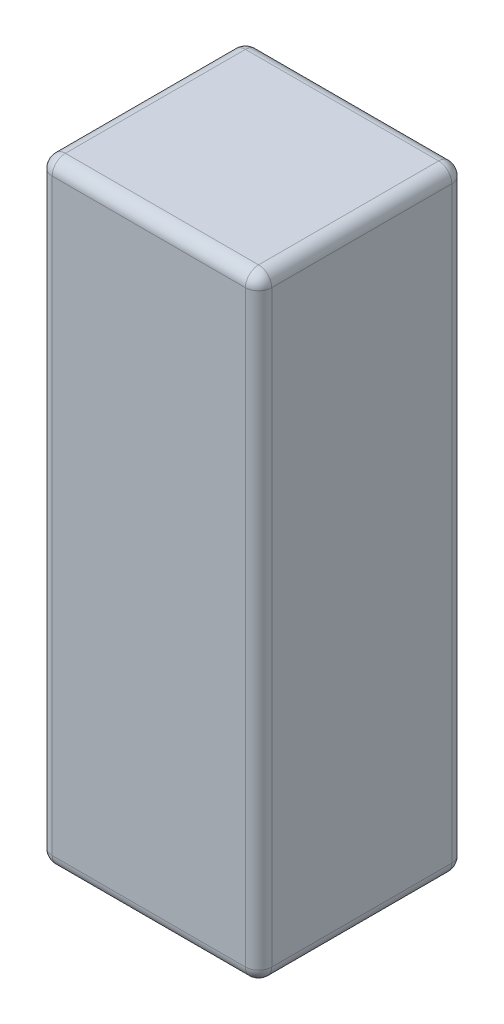
ISO-10303-21;
HEADER;
FILE_DESCRIPTION(('STEP AP214'),'2;1');
FILE_NAME('part.step','',(''),(''),'','','');
FILE_SCHEMA(('AUTOMOTIVE_DESIGN { 1 0 10303 214 1 1 1 1 }'));
ENDSEC;
DATA;
#1=APPLICATION_CONTEXT('core data for automotive mechanical design processes');
#2=APPLICATION_PROTOCOL_DEFINITION('international standard','automotive_design',2000,#1);
#3=PRODUCT_CONTEXT('',#1,'mechanical');
#4=PRODUCT('Part','Part','',(#3));
#5=PRODUCT_RELATED_PRODUCT_CATEGORY('part','',(#4));
#6=PRODUCT_DEFINITION_FORMATION('','',#4);
#7=PRODUCT_DEFINITION_CONTEXT('part definition',#1,'design');
#8=PRODUCT_DEFINITION('design','',#6,#7);
#9=PRODUCT_DEFINITION_SHAPE('','',#8);
#10=(LENGTH_UNIT() NAMED_UNIT(*) SI_UNIT(.MILLI.,.METRE.));
#11=(NAMED_UNIT(*) PLANE_ANGLE_UNIT() SI_UNIT($,.RADIAN.));
#12=(NAMED_UNIT(*) SI_UNIT($,.STERADIAN.) SOLID_ANGLE_UNIT());
#13=UNCERTAINTY_MEASURE_WITH_UNIT(LENGTH_MEASURE(1.E-05),#10,'distance_accuracy_value','');
#14=(GEOMETRIC_REPRESENTATION_CONTEXT(3) GLOBAL_UNCERTAINTY_ASSIGNED_CONTEXT((#13)) GLOBAL_UNIT_ASSIGNED_CONTEXT((#10,
#11,#12)) REPRESENTATION_CONTEXT('',''));
#15=CARTESIAN_POINT('',(0.,0.,0.));
#16=DIRECTION('',(0.,0.,1.));
#17=DIRECTION('',(1.,0.,0.));
#18=AXIS2_PLACEMENT_3D('',#15,#16,#17);
#19=CARTESIAN_POINT('',(25.,-70.,47.));
#20=DIRECTION('',(-1.,0.,0.));
#21=DIRECTION('',(0.,0.,1.));
#22=AXIS2_PLACEMENT_3D('',#19,#20,#21);
#23=PLANE('',#22);
#24=DIRECTION('',(0.,1.,0.));
#25=VECTOR('',#24,1.);
#26=CARTESIAN_POINT('',(25.,-70.,44.));
#27=LINE('',#26,#25);
#28=CARTESIAN_POINT('',(25.,67.,44.));
#29=VERTEX_POINT('',#28);
#30=CARTESIAN_POINT('',(25.,-67.,44.));
#31=VERTEX_POINT('',#30);
#32=EDGE_CURVE('E190',#29,#31,#27,.F.);
#33=ORIENTED_EDGE('',*,*,#32,.T.);
#34=DIRECTION('',(0.,0.,-1.));
#35=VECTOR('',#34,1.);
#36=CARTESIAN_POINT('',(25.,-67.,47.));
#37=LINE('',#36,#35);
#38=CARTESIAN_POINT('',(25.,-67.,3.));
#39=VERTEX_POINT('',#38);
#40=EDGE_CURVE('E143',#31,#39,#37,.T.);
#41=ORIENTED_EDGE('',*,*,#40,.T.);
#42=DIRECTION('',(0.,1.,0.));
#43=VECTOR('',#42,1.);
#44=CARTESIAN_POINT('',(25.,70.,3.));
#45=LINE('',#44,#43);
#46=CARTESIAN_POINT('',(25.,67.,3.));
#47=VERTEX_POINT('',#46);
#48=EDGE_CURVE('E186',#39,#47,#45,.T.);
#49=ORIENTED_EDGE('',*,*,#48,.T.);
#50=DIRECTION('',(0.,0.,-1.));
#51=VECTOR('',#50,1.);
#52=CARTESIAN_POINT('',(25.,67.,47.));
#53=LINE('',#52,#51);
#54=EDGE_CURVE('E188',#47,#29,#53,.F.);
#55=ORIENTED_EDGE('',*,*,#54,.T.);
#56=EDGE_LOOP('',(#33,#41,#49,#55));
#57=FACE_BOUND('',#56,.T.);
#58=ADVANCED_FACE('F34',(#57),#23,.F.);
#59=CARTESIAN_POINT('',(-25.,70.,47.));
#60=DIRECTION('',(0.,-1.,0.));
#61=DIRECTION('',(0.,0.,-1.));
#62=AXIS2_PLACEMENT_3D('',#59,#60,#61);
#63=PLANE('',#62);
#64=DIRECTION('',(0.,0.,-1.));
#65=VECTOR('',#64,1.);
#66=CARTESIAN_POINT('',(-22.,70.,47.));
#67=LINE('',#66,#65);
#68=CARTESIAN_POINT('',(-22.,70.,3.));
#69=VERTEX_POINT('',#68);
#70=CARTESIAN_POINT('',(-22.,70.,44.));
#71=VERTEX_POINT('',#70);
#72=EDGE_CURVE('E43',#69,#71,#67,.F.);
#73=ORIENTED_EDGE('',*,*,#72,.T.);
#74=DIRECTION('',(-1.,0.,0.));
#75=VECTOR('',#74,1.);
#76=CARTESIAN_POINT('',(-25.,70.,44.));
#77=LINE('',#76,#75);
#78=CARTESIAN_POINT('',(22.,70.,44.));
#79=VERTEX_POINT('',#78);
#80=EDGE_CURVE('E11',#71,#79,#77,.F.);
#81=ORIENTED_EDGE('',*,*,#80,.T.);
#82=DIRECTION('',(0.,0.,-1.));
#83=VECTOR('',#82,1.);
#84=CARTESIAN_POINT('',(22.,70.,47.));
#85=LINE('',#84,#83);
#86=CARTESIAN_POINT('',(22.,70.,3.));
#87=VERTEX_POINT('',#86);
#88=EDGE_CURVE('E204',#79,#87,#85,.T.);
#89=ORIENTED_EDGE('',*,*,#88,.T.);
#90=DIRECTION('',(-1.,0.,0.));
#91=VECTOR('',#90,1.);
#92=CARTESIAN_POINT('',(-25.,70.,3.));
#93=LINE('',#92,#91);
#94=EDGE_CURVE('E202',#87,#69,#93,.T.);
#95=ORIENTED_EDGE('',*,*,#94,.T.);
#96=EDGE_LOOP('',(#73,#81,#89,#95));
#97=FACE_BOUND('',#96,.T.);
#98=ADVANCED_FACE('F276',(#97),#63,.F.);
#99=CARTESIAN_POINT('',(-25.,-70.,47.));
#100=DIRECTION('',(1.,0.,0.));
#101=DIRECTION('',(0.,0.,-1.));
#102=AXIS2_PLACEMENT_3D('',#99,#100,#101);
#103=PLANE('',#102);
#104=DIRECTION('',(0.,-1.,0.));
#105=VECTOR('',#104,1.);
#106=CARTESIAN_POINT('',(-25.,-70.,3.));
#107=LINE('',#106,#105);
#108=CARTESIAN_POINT('',(-25.,67.,3.));
#109=VERTEX_POINT('',#108);
#110=CARTESIAN_POINT('',(-25.,-67.,3.));
#111=VERTEX_POINT('',#110);
#112=EDGE_CURVE('E172',#109,#111,#107,.T.);
#113=ORIENTED_EDGE('',*,*,#112,.T.);
#114=DIRECTION('',(0.,0.,-1.));
#115=VECTOR('',#114,1.);
#116=CARTESIAN_POINT('',(-25.,-67.,47.));
#117=LINE('',#116,#115);
#118=CARTESIAN_POINT('',(-25.,-67.,44.));
#119=VERTEX_POINT('',#118);
#120=EDGE_CURVE('E174',#111,#119,#117,.F.);
#121=ORIENTED_EDGE('',*,*,#120,.T.);
#122=DIRECTION('',(0.,-1.,0.));
#123=VECTOR('',#122,1.);
#124=CARTESIAN_POINT('',(-25.,-70.,44.));
#125=LINE('',#124,#123);
#126=CARTESIAN_POINT('',(-25.,67.,44.));
#127=VERTEX_POINT('',#126);
#128=EDGE_CURVE('E170',#119,#127,#125,.F.);
#129=ORIENTED_EDGE('',*,*,#128,.T.);
#130=DIRECTION('',(0.,0.,-1.));
#131=VECTOR('',#130,1.);
#132=CARTESIAN_POINT('',(-25.,67.,47.));
#133=LINE('',#132,#131);
#134=EDGE_CURVE('E168',#127,#109,#133,.T.);
#135=ORIENTED_EDGE('',*,*,#134,.T.);
#136=EDGE_LOOP('',(#113,#121,#129,#135));
#137=FACE_BOUND('',#136,.T.);
#138=ADVANCED_FACE('F310',(#137),#103,.F.);
#139=CARTESIAN_POINT('',(-25.,-70.,47.));
#140=DIRECTION('',(0.,1.,0.));
#141=DIRECTION('',(0.,0.,1.));
#142=AXIS2_PLACEMENT_3D('',#139,#140,#141);
#143=PLANE('',#142);
#144=DIRECTION('',(1.,0.,0.));
#145=VECTOR('',#144,1.);
#146=CARTESIAN_POINT('',(-25.,-70.,44.));
#147=LINE('',#146,#145);
#148=CARTESIAN_POINT('',(22.,-70.,44.));
#149=VERTEX_POINT('',#148);
#150=CARTESIAN_POINT('',(-22.,-70.,44.));
#151=VERTEX_POINT('',#150);
#152=EDGE_CURVE('E129',#149,#151,#147,.F.);
#153=ORIENTED_EDGE('',*,*,#152,.T.);
#154=DIRECTION('',(0.,0.,-1.));
#155=VECTOR('',#154,1.);
#156=CARTESIAN_POINT('',(-22.,-70.,47.));
#157=LINE('',#156,#155);
#158=CARTESIAN_POINT('',(-22.,-70.,3.));
#159=VERTEX_POINT('',#158);
#160=EDGE_CURVE('E166',#151,#159,#157,.T.);
#161=ORIENTED_EDGE('',*,*,#160,.T.);
#162=DIRECTION('',(1.,0.,0.));
#163=VECTOR('',#162,1.);
#164=CARTESIAN_POINT('',(25.,-70.,3.));
#165=LINE('',#164,#163);
#166=CARTESIAN_POINT('',(22.,-70.,3.));
#167=VERTEX_POINT('',#166);
#168=EDGE_CURVE('E132',#159,#167,#165,.T.);
#169=ORIENTED_EDGE('',*,*,#168,.T.);
#170=DIRECTION('',(0.,0.,-1.));
#171=VECTOR('',#170,1.);
#172=CARTESIAN_POINT('',(22.,-70.,47.));
#173=LINE('',#172,#171);
#174=EDGE_CURVE('E124',#167,#149,#173,.F.);
#175=ORIENTED_EDGE('',*,*,#174,.T.);
#176=EDGE_LOOP('',(#153,#161,#169,#175));
#177=FACE_BOUND('',#176,.T.);
#178=ADVANCED_FACE('F126',(#177),#143,.F.);
#179=CARTESIAN_POINT('',(0.,0.,47.));
#180=DIRECTION('',(0.,0.,-1.));
#181=DIRECTION('',(-1.,0.,0.));
#182=AXIS2_PLACEMENT_3D('',#179,#180,#181);
#183=PLANE('',#182);
#184=DIRECTION('',(0.,-1.,0.));
#185=VECTOR('',#184,1.);
#186=CARTESIAN_POINT('',(-22.,0.,47.));
#187=LINE('',#186,#185);
#188=CARTESIAN_POINT('',(-22.,67.,47.));
#189=VERTEX_POINT('',#188);
#190=CARTESIAN_POINT('',(-22.,-67.,47.));
#191=VERTEX_POINT('',#190);
#192=EDGE_CURVE('E195',#189,#191,#187,.T.);
#193=ORIENTED_EDGE('',*,*,#192,.T.);
#194=DIRECTION('',(1.,0.,0.));
#195=VECTOR('',#194,1.);
#196=CARTESIAN_POINT('',(0.,-67.,47.));
#197=LINE('',#196,#195);
#198=CARTESIAN_POINT('',(22.,-67.,47.));
#199=VERTEX_POINT('',#198);
#200=EDGE_CURVE('E199',#191,#199,#197,.T.);
#201=ORIENTED_EDGE('',*,*,#200,.T.);
#202=DIRECTION('',(0.,1.,0.));
#203=VECTOR('',#202,1.);
#204=CARTESIAN_POINT('',(22.,0.,47.));
#205=LINE('',#204,#203);
#206=CARTESIAN_POINT('',(22.,67.,47.));
#207=VERTEX_POINT('',#206);
#208=EDGE_CURVE('E197',#199,#207,#205,.T.);
#209=ORIENTED_EDGE('',*,*,#208,.T.);
#210=DIRECTION('',(-1.,0.,0.));
#211=VECTOR('',#210,1.);
#212=CARTESIAN_POINT('',(0.,67.,47.));
#213=LINE('',#212,#211);
#214=EDGE_CURVE('E193',#207,#189,#213,.T.);
#215=ORIENTED_EDGE('',*,*,#214,.T.);
#216=EDGE_LOOP('',(#193,#201,#209,#215));
#217=FACE_BOUND('',#216,.T.);
#218=ADVANCED_FACE('F290',(#217),#183,.F.);
#219=CARTESIAN_POINT('',(0.,0.,0.));
#220=DIRECTION('',(0.,0.,-1.));
#221=DIRECTION('',(-1.,0.,0.));
#222=AXIS2_PLACEMENT_3D('',#219,#220,#221);
#223=PLANE('',#222);
#224=DIRECTION('',(0.,1.,0.));
#225=VECTOR('',#224,1.);
#226=CARTESIAN_POINT('',(22.,-70.,0.));
#227=LINE('',#226,#225);
#228=CARTESIAN_POINT('',(22.,67.,0.));
#229=VERTEX_POINT('',#228);
#230=CARTESIAN_POINT('',(22.,-67.,0.));
#231=VERTEX_POINT('',#230);
#232=EDGE_CURVE('E179',#229,#231,#227,.F.);
#233=ORIENTED_EDGE('',*,*,#232,.T.);
#234=DIRECTION('',(1.,0.,0.));
#235=VECTOR('',#234,1.);
#236=CARTESIAN_POINT('',(-25.,-67.,0.));
#237=LINE('',#236,#235);
#238=CARTESIAN_POINT('',(-22.,-67.,0.));
#239=VERTEX_POINT('',#238);
#240=EDGE_CURVE('E183',#231,#239,#237,.F.);
#241=ORIENTED_EDGE('',*,*,#240,.T.);
#242=DIRECTION('',(0.,-1.,0.));
#243=VECTOR('',#242,1.);
#244=CARTESIAN_POINT('',(-22.,70.,0.));
#245=LINE('',#244,#243);
#246=CARTESIAN_POINT('',(-22.,67.,0.));
#247=VERTEX_POINT('',#246);
#248=EDGE_CURVE('E181',#239,#247,#245,.F.);
#249=ORIENTED_EDGE('',*,*,#248,.T.);
#250=DIRECTION('',(-1.,0.,0.));
#251=VECTOR('',#250,1.);
#252=CARTESIAN_POINT('',(25.,67.,0.));
#253=LINE('',#252,#251);
#254=EDGE_CURVE('E177',#247,#229,#253,.F.);
#255=ORIENTED_EDGE('',*,*,#254,.T.);
#256=EDGE_LOOP('',(#233,#241,#249,#255));
#257=FACE_BOUND('',#256,.T.);
#258=ADVANCED_FACE('F269',(#257),#223,.T.);
#259=CARTESIAN_POINT('',(22.,67.,47.));
#260=DIRECTION('',(0.,0.,-1.));
#261=DIRECTION('',(-1.,0.,0.));
#262=AXIS2_PLACEMENT_3D('',#259,#260,#261);
#263=CYLINDRICAL_SURFACE('',#262,3.);
#264=CARTESIAN_POINT('',(22.,67.,44.));
#265=DIRECTION('',(0.,0.,1.));
#266=DIRECTION('',(1.,0.,0.));
#267=AXIS2_PLACEMENT_3D('',#264,#265,#266);
#268=CIRCLE('',#267,3.);
#269=EDGE_CURVE('E38',#29,#79,#268,.T.);
#270=ORIENTED_EDGE('',*,*,#269,.F.);
#271=ORIENTED_EDGE('',*,*,#54,.F.);
#272=CARTESIAN_POINT('',(22.,67.,3.));
#273=DIRECTION('',(0.,0.,-1.));
#274=DIRECTION('',(-1.,0.,0.));
#275=AXIS2_PLACEMENT_3D('',#272,#273,#274);
#276=CIRCLE('',#275,3.);
#277=EDGE_CURVE('E163',#87,#47,#276,.T.);
#278=ORIENTED_EDGE('',*,*,#277,.F.);
#279=ORIENTED_EDGE('',*,*,#88,.F.);
#280=EDGE_LOOP('',(#270,#271,#278,#279));
#281=FACE_BOUND('',#280,.T.);
#282=ADVANCED_FACE('F36',(#281),#263,.T.);
#283=CARTESIAN_POINT('',(22.,67.,44.));
#284=DIRECTION('',(0.,0.,1.));
#285=DIRECTION('',(1.,0.,0.));
#286=AXIS2_PLACEMENT_3D('',#283,#284,#285);
#287=SPHERICAL_SURFACE('',#286,3.);
#288=CARTESIAN_POINT('',(22.,67.,44.));
#289=DIRECTION('',(0.,1.,0.));
#290=DIRECTION('',(0.,0.,1.));
#291=AXIS2_PLACEMENT_3D('',#288,#289,#290);
#292=CIRCLE('',#291,3.);
#293=EDGE_CURVE('E249',#29,#207,#292,.F.);
#294=ORIENTED_EDGE('',*,*,#293,.F.);
#295=ORIENTED_EDGE('',*,*,#269,.T.);
#296=CARTESIAN_POINT('',(22.,67.,44.));
#297=DIRECTION('',(1.,0.,0.));
#298=DIRECTION('',(0.,0.,-1.));
#299=AXIS2_PLACEMENT_3D('',#296,#297,#298);
#300=CIRCLE('',#299,3.);
#301=EDGE_CURVE('E56',#207,#79,#300,.F.);
#302=ORIENTED_EDGE('',*,*,#301,.F.);
#303=EDGE_LOOP('',(#294,#295,#302));
#304=FACE_BOUND('',#303,.T.);
#305=ADVANCED_FACE('F296',(#304),#287,.T.);
#306=CARTESIAN_POINT('',(22.,67.,3.));
#307=DIRECTION('',(0.,0.,1.));
#308=DIRECTION('',(1.,0.,0.));
#309=AXIS2_PLACEMENT_3D('',#306,#307,#308);
#310=SPHERICAL_SURFACE('',#309,3.);
#311=CARTESIAN_POINT('',(22.,67.,3.));
#312=DIRECTION('',(1.,0.,0.));
#313=DIRECTION('',(0.,1.,0.));
#314=AXIS2_PLACEMENT_3D('',#311,#312,#313);
#315=CIRCLE('',#314,3.);
#316=EDGE_CURVE('E243',#87,#229,#315,.F.);
#317=ORIENTED_EDGE('',*,*,#316,.F.);
#318=ORIENTED_EDGE('',*,*,#277,.T.);
#319=CARTESIAN_POINT('',(22.,67.,3.));
#320=DIRECTION('',(0.,1.,0.));
#321=DIRECTION('',(0.,0.,1.));
#322=AXIS2_PLACEMENT_3D('',#319,#320,#321);
#323=CIRCLE('',#322,3.);
#324=EDGE_CURVE('E246',#229,#47,#323,.F.);
#325=ORIENTED_EDGE('',*,*,#324,.F.);
#326=EDGE_LOOP('',(#317,#318,#325));
#327=FACE_BOUND('',#326,.T.);
#328=ADVANCED_FACE('F257',(#327),#310,.T.);
#329=CARTESIAN_POINT('',(0.,67.,44.));
#330=DIRECTION('',(-1.,0.,0.));
#331=DIRECTION('',(0.,0.,1.));
#332=AXIS2_PLACEMENT_3D('',#329,#330,#331);
#333=CYLINDRICAL_SURFACE('',#332,3.);
#334=ORIENTED_EDGE('',*,*,#301,.T.);
#335=ORIENTED_EDGE('',*,*,#80,.F.);
#336=CARTESIAN_POINT('',(-22.,67.,44.));
#337=DIRECTION('',(-1.,0.,0.));
#338=DIRECTION('',(0.,0.,1.));
#339=AXIS2_PLACEMENT_3D('',#336,#337,#338);
#340=CIRCLE('',#339,3.);
#341=EDGE_CURVE('E237',#189,#71,#340,.T.);
#342=ORIENTED_EDGE('',*,*,#341,.F.);
#343=ORIENTED_EDGE('',*,*,#214,.F.);
#344=EDGE_LOOP('',(#334,#335,#342,#343));
#345=FACE_BOUND('',#344,.T.);
#346=ADVANCED_FACE('F288',(#345),#333,.T.);
#347=CARTESIAN_POINT('',(22.,0.,44.));
#348=DIRECTION('',(0.,1.,0.));
#349=DIRECTION('',(0.,0.,1.));
#350=AXIS2_PLACEMENT_3D('',#347,#348,#349);
#351=CYLINDRICAL_SURFACE('',#350,3.);
#352=ORIENTED_EDGE('',*,*,#293,.T.);
#353=ORIENTED_EDGE('',*,*,#208,.F.);
#354=CARTESIAN_POINT('',(22.,-67.,44.));
#355=DIRECTION('',(0.,-1.,0.));
#356=DIRECTION('',(0.,0.,-1.));
#357=AXIS2_PLACEMENT_3D('',#354,#355,#356);
#358=CIRCLE('',#357,3.);
#359=EDGE_CURVE('E147',#31,#199,#358,.T.);
#360=ORIENTED_EDGE('',*,*,#359,.F.);
#361=ORIENTED_EDGE('',*,*,#32,.F.);
#362=EDGE_LOOP('',(#352,#353,#360,#361));
#363=FACE_BOUND('',#362,.T.);
#364=ADVANCED_FACE('F294',(#363),#351,.T.);
#365=CARTESIAN_POINT('',(22.,-67.,47.));
#366=DIRECTION('',(0.,0.,-1.));
#367=DIRECTION('',(-1.,0.,0.));
#368=AXIS2_PLACEMENT_3D('',#365,#366,#367);
#369=CYLINDRICAL_SURFACE('',#368,3.);
#370=CARTESIAN_POINT('',(22.,-67.,3.));
#371=DIRECTION('',(0.,0.,-1.));
#372=DIRECTION('',(-1.,0.,0.));
#373=AXIS2_PLACEMENT_3D('',#370,#371,#372);
#374=CIRCLE('',#373,3.);
#375=EDGE_CURVE('E148',#39,#167,#374,.T.);
#376=ORIENTED_EDGE('',*,*,#375,.F.);
#377=ORIENTED_EDGE('',*,*,#40,.F.);
#378=CARTESIAN_POINT('',(22.,-67.,44.));
#379=DIRECTION('',(0.,0.,1.));
#380=DIRECTION('',(1.,0.,0.));
#381=AXIS2_PLACEMENT_3D('',#378,#379,#380);
#382=CIRCLE('',#381,3.);
#383=EDGE_CURVE('E139',#149,#31,#382,.T.);
#384=ORIENTED_EDGE('',*,*,#383,.F.);
#385=ORIENTED_EDGE('',*,*,#174,.F.);
#386=EDGE_LOOP('',(#376,#377,#384,#385));
#387=FACE_BOUND('',#386,.T.);
#388=ADVANCED_FACE('F141',(#387),#369,.T.);
#389=CARTESIAN_POINT('',(22.,-70.,3.));
#390=DIRECTION('',(0.,-1.,0.));
#391=DIRECTION('',(0.,0.,-1.));
#392=AXIS2_PLACEMENT_3D('',#389,#390,#391);
#393=CYLINDRICAL_SURFACE('',#392,3.);
#394=ORIENTED_EDGE('',*,*,#324,.T.);
#395=ORIENTED_EDGE('',*,*,#48,.F.);
#396=CARTESIAN_POINT('',(22.,-67.,3.));
#397=DIRECTION('',(0.,-1.,0.));
#398=DIRECTION('',(0.,0.,-1.));
#399=AXIS2_PLACEMENT_3D('',#396,#397,#398);
#400=CIRCLE('',#399,3.);
#401=EDGE_CURVE('E233',#231,#39,#400,.T.);
#402=ORIENTED_EDGE('',*,*,#401,.F.);
#403=ORIENTED_EDGE('',*,*,#232,.F.);
#404=EDGE_LOOP('',(#394,#395,#402,#403));
#405=FACE_BOUND('',#404,.T.);
#406=ADVANCED_FACE('F265',(#405),#393,.T.);
#407=CARTESIAN_POINT('',(-25.,67.,3.));
#408=DIRECTION('',(1.,0.,0.));
#409=DIRECTION('',(0.,0.,-1.));
#410=AXIS2_PLACEMENT_3D('',#407,#408,#409);
#411=CYLINDRICAL_SURFACE('',#410,3.);
#412=ORIENTED_EDGE('',*,*,#316,.T.);
#413=ORIENTED_EDGE('',*,*,#254,.F.);
#414=CARTESIAN_POINT('',(-22.,67.,3.));
#415=DIRECTION('',(-1.,0.,0.));
#416=DIRECTION('',(0.,0.,1.));
#417=AXIS2_PLACEMENT_3D('',#414,#415,#416);
#418=CIRCLE('',#417,3.);
#419=EDGE_CURVE('E230',#69,#247,#418,.T.);
#420=ORIENTED_EDGE('',*,*,#419,.F.);
#421=ORIENTED_EDGE('',*,*,#94,.F.);
#422=EDGE_LOOP('',(#412,#413,#420,#421));
#423=FACE_BOUND('',#422,.T.);
#424=ADVANCED_FACE('F275',(#423),#411,.T.);
#425=CARTESIAN_POINT('',(-22.,67.,47.));
#426=DIRECTION('',(0.,0.,-1.));
#427=DIRECTION('',(-1.,0.,0.));
#428=AXIS2_PLACEMENT_3D('',#425,#426,#427);
#429=CYLINDRICAL_SURFACE('',#428,3.);
#430=CARTESIAN_POINT('',(-22.,67.,44.));
#431=DIRECTION('',(0.,0.,1.));
#432=DIRECTION('',(1.,0.,0.));
#433=AXIS2_PLACEMENT_3D('',#430,#431,#432);
#434=CIRCLE('',#433,3.);
#435=EDGE_CURVE('E240',#71,#127,#434,.T.);
#436=ORIENTED_EDGE('',*,*,#435,.F.);
#437=ORIENTED_EDGE('',*,*,#72,.F.);
#438=CARTESIAN_POINT('',(-22.,67.,3.));
#439=DIRECTION('',(0.,0.,-1.));
#440=DIRECTION('',(-1.,0.,0.));
#441=AXIS2_PLACEMENT_3D('',#438,#439,#440);
#442=CIRCLE('',#441,3.);
#443=EDGE_CURVE('E227',#109,#69,#442,.T.);
#444=ORIENTED_EDGE('',*,*,#443,.F.);
#445=ORIENTED_EDGE('',*,*,#134,.F.);
#446=EDGE_LOOP('',(#436,#437,#444,#445));
#447=FACE_BOUND('',#446,.T.);
#448=ADVANCED_FACE('F280',(#447),#429,.T.);
#449=CARTESIAN_POINT('',(-22.,67.,44.));
#450=DIRECTION('',(0.,0.,1.));
#451=DIRECTION('',(1.,0.,0.));
#452=AXIS2_PLACEMENT_3D('',#449,#450,#451);
#453=SPHERICAL_SURFACE('',#452,3.);
#454=ORIENTED_EDGE('',*,*,#341,.T.);
#455=ORIENTED_EDGE('',*,*,#435,.T.);
#456=CARTESIAN_POINT('',(-22.,67.,44.));
#457=DIRECTION('',(0.,1.,0.));
#458=DIRECTION('',(0.,0.,1.));
#459=AXIS2_PLACEMENT_3D('',#456,#457,#458);
#460=CIRCLE('',#459,3.);
#461=EDGE_CURVE('E155',#189,#127,#460,.F.);
#462=ORIENTED_EDGE('',*,*,#461,.F.);
#463=EDGE_LOOP('',(#454,#455,#462));
#464=FACE_BOUND('',#463,.T.);
#465=ADVANCED_FACE('F286',(#464),#453,.T.);
#466=CARTESIAN_POINT('',(22.,-67.,44.));
#467=DIRECTION('',(0.,0.,1.));
#468=DIRECTION('',(1.,0.,0.));
#469=AXIS2_PLACEMENT_3D('',#466,#467,#468);
#470=SPHERICAL_SURFACE('',#469,3.);
#471=ORIENTED_EDGE('',*,*,#383,.T.);
#472=ORIENTED_EDGE('',*,*,#359,.T.);
#473=CARTESIAN_POINT('',(22.,-67.,44.));
#474=DIRECTION('',(1.,0.,0.));
#475=DIRECTION('',(0.,0.,-1.));
#476=AXIS2_PLACEMENT_3D('',#473,#474,#475);
#477=CIRCLE('',#476,3.);
#478=EDGE_CURVE('E150',#149,#199,#477,.F.);
#479=ORIENTED_EDGE('',*,*,#478,.F.);
#480=EDGE_LOOP('',(#471,#472,#479));
#481=FACE_BOUND('',#480,.T.);
#482=ADVANCED_FACE('F151',(#481),#470,.T.);
#483=CARTESIAN_POINT('',(22.,-67.,3.));
#484=DIRECTION('',(0.,0.,1.));
#485=DIRECTION('',(1.,0.,0.));
#486=AXIS2_PLACEMENT_3D('',#483,#484,#485);
#487=SPHERICAL_SURFACE('',#486,3.);
#488=ORIENTED_EDGE('',*,*,#401,.T.);
#489=ORIENTED_EDGE('',*,*,#375,.T.);
#490=CARTESIAN_POINT('',(22.,-67.,3.));
#491=DIRECTION('',(1.,0.,0.));
#492=DIRECTION('',(0.,0.,-1.));
#493=AXIS2_PLACEMENT_3D('',#490,#491,#492);
#494=CIRCLE('',#493,3.);
#495=EDGE_CURVE('E156',#231,#167,#494,.F.);
#496=ORIENTED_EDGE('',*,*,#495,.F.);
#497=EDGE_LOOP('',(#488,#489,#496));
#498=FACE_BOUND('',#497,.T.);
#499=ADVANCED_FACE('F343',(#498),#487,.T.);
#500=CARTESIAN_POINT('',(-22.,67.,3.));
#501=DIRECTION('',(0.,0.,1.));
#502=DIRECTION('',(1.,0.,0.));
#503=AXIS2_PLACEMENT_3D('',#500,#501,#502);
#504=SPHERICAL_SURFACE('',#503,3.);
#505=ORIENTED_EDGE('',*,*,#443,.T.);
#506=ORIENTED_EDGE('',*,*,#419,.T.);
#507=CARTESIAN_POINT('',(-22.,67.,3.));
#508=DIRECTION('',(0.,1.,0.));
#509=DIRECTION('',(0.,0.,1.));
#510=AXIS2_PLACEMENT_3D('',#507,#508,#509);
#511=CIRCLE('',#510,3.);
#512=EDGE_CURVE('E220',#109,#247,#511,.F.);
#513=ORIENTED_EDGE('',*,*,#512,.F.);
#514=EDGE_LOOP('',(#505,#506,#513));
#515=FACE_BOUND('',#514,.T.);
#516=ADVANCED_FACE('F339',(#515),#504,.T.);
#517=CARTESIAN_POINT('',(-22.,0.,44.));
#518=DIRECTION('',(0.,-1.,0.));
#519=DIRECTION('',(0.,0.,-1.));
#520=AXIS2_PLACEMENT_3D('',#517,#518,#519);
#521=CYLINDRICAL_SURFACE('',#520,3.);
#522=ORIENTED_EDGE('',*,*,#461,.T.);
#523=ORIENTED_EDGE('',*,*,#128,.F.);
#524=CARTESIAN_POINT('',(-22.,-67.,44.));
#525=DIRECTION('',(0.,-1.,0.));
#526=DIRECTION('',(0.,0.,-1.));
#527=AXIS2_PLACEMENT_3D('',#524,#525,#526);
#528=CIRCLE('',#527,3.);
#529=EDGE_CURVE('E217',#191,#119,#528,.T.);
#530=ORIENTED_EDGE('',*,*,#529,.F.);
#531=ORIENTED_EDGE('',*,*,#192,.F.);
#532=EDGE_LOOP('',(#522,#523,#530,#531));
#533=FACE_BOUND('',#532,.T.);
#534=ADVANCED_FACE('F336',(#533),#521,.T.);
#535=CARTESIAN_POINT('',(0.,-67.,44.));
#536=DIRECTION('',(1.,0.,0.));
#537=DIRECTION('',(0.,0.,-1.));
#538=AXIS2_PLACEMENT_3D('',#535,#536,#537);
#539=CYLINDRICAL_SURFACE('',#538,3.);
#540=ORIENTED_EDGE('',*,*,#478,.T.);
#541=ORIENTED_EDGE('',*,*,#200,.F.);
#542=CARTESIAN_POINT('',(-22.,-67.,44.));
#543=DIRECTION('',(-1.,0.,0.));
#544=DIRECTION('',(0.,0.,1.));
#545=AXIS2_PLACEMENT_3D('',#542,#543,#544);
#546=CIRCLE('',#545,3.);
#547=EDGE_CURVE('E160',#151,#191,#546,.T.);
#548=ORIENTED_EDGE('',*,*,#547,.F.);
#549=ORIENTED_EDGE('',*,*,#152,.F.);
#550=EDGE_LOOP('',(#540,#541,#548,#549));
#551=FACE_BOUND('',#550,.T.);
#552=ADVANCED_FACE('F158',(#551),#539,.T.);
#553=CARTESIAN_POINT('',(-25.,-67.,3.));
#554=DIRECTION('',(-1.,0.,0.));
#555=DIRECTION('',(0.,0.,1.));
#556=AXIS2_PLACEMENT_3D('',#553,#554,#555);
#557=CYLINDRICAL_SURFACE('',#556,3.);
#558=ORIENTED_EDGE('',*,*,#495,.T.);
#559=ORIENTED_EDGE('',*,*,#168,.F.);
#560=CARTESIAN_POINT('',(-22.,-67.,3.));
#561=DIRECTION('',(-1.,0.,0.));
#562=DIRECTION('',(0.,0.,1.));
#563=AXIS2_PLACEMENT_3D('',#560,#561,#562);
#564=CIRCLE('',#563,3.);
#565=EDGE_CURVE('E213',#239,#159,#564,.T.);
#566=ORIENTED_EDGE('',*,*,#565,.F.);
#567=ORIENTED_EDGE('',*,*,#240,.F.);
#568=EDGE_LOOP('',(#558,#559,#566,#567));
#569=FACE_BOUND('',#568,.T.);
#570=ADVANCED_FACE('F329',(#569),#557,.T.);
#571=CARTESIAN_POINT('',(-22.,-70.,3.));
#572=DIRECTION('',(0.,1.,0.));
#573=DIRECTION('',(0.,0.,1.));
#574=AXIS2_PLACEMENT_3D('',#571,#572,#573);
#575=CYLINDRICAL_SURFACE('',#574,3.);
#576=ORIENTED_EDGE('',*,*,#512,.T.);
#577=ORIENTED_EDGE('',*,*,#248,.F.);
#578=CARTESIAN_POINT('',(-22.,-67.,3.));
#579=DIRECTION('',(0.,-1.,0.));
#580=DIRECTION('',(0.,0.,-1.));
#581=AXIS2_PLACEMENT_3D('',#578,#579,#580);
#582=CIRCLE('',#581,3.);
#583=EDGE_CURVE('E211',#111,#239,#582,.T.);
#584=ORIENTED_EDGE('',*,*,#583,.F.);
#585=ORIENTED_EDGE('',*,*,#112,.F.);
#586=EDGE_LOOP('',(#576,#577,#584,#585));
#587=FACE_BOUND('',#586,.T.);
#588=ADVANCED_FACE('F325',(#587),#575,.T.);
#589=CARTESIAN_POINT('',(-22.,-67.,44.));
#590=DIRECTION('',(0.,0.,1.));
#591=DIRECTION('',(1.,0.,0.));
#592=AXIS2_PLACEMENT_3D('',#589,#590,#591);
#593=SPHERICAL_SURFACE('',#592,3.);
#594=ORIENTED_EDGE('',*,*,#547,.T.);
#595=ORIENTED_EDGE('',*,*,#529,.T.);
#596=CARTESIAN_POINT('',(-22.,-67.,44.));
#597=DIRECTION('',(0.,0.,1.));
#598=DIRECTION('',(1.,0.,0.));
#599=AXIS2_PLACEMENT_3D('',#596,#597,#598);
#600=CIRCLE('',#599,3.);
#601=EDGE_CURVE('E209',#151,#119,#600,.F.);
#602=ORIENTED_EDGE('',*,*,#601,.F.);
#603=EDGE_LOOP('',(#594,#595,#602));
#604=FACE_BOUND('',#603,.T.);
#605=ADVANCED_FACE('F321',(#604),#593,.T.);
#606=CARTESIAN_POINT('',(-22.,-67.,3.));
#607=DIRECTION('',(0.,0.,1.));
#608=DIRECTION('',(1.,0.,0.));
#609=AXIS2_PLACEMENT_3D('',#606,#607,#608);
#610=SPHERICAL_SURFACE('',#609,3.);
#611=ORIENTED_EDGE('',*,*,#583,.T.);
#612=ORIENTED_EDGE('',*,*,#565,.T.);
#613=CARTESIAN_POINT('',(-22.,-67.,3.));
#614=DIRECTION('',(0.,0.,-1.));
#615=DIRECTION('',(-1.,0.,0.));
#616=AXIS2_PLACEMENT_3D('',#613,#614,#615);
#617=CIRCLE('',#616,3.);
#618=EDGE_CURVE('E207',#111,#159,#617,.F.);
#619=ORIENTED_EDGE('',*,*,#618,.F.);
#620=EDGE_LOOP('',(#611,#612,#619));
#621=FACE_BOUND('',#620,.T.);
#622=ADVANCED_FACE('F317',(#621),#610,.T.);
#623=CARTESIAN_POINT('',(-22.,-67.,47.));
#624=DIRECTION('',(0.,0.,-1.));
#625=DIRECTION('',(-1.,0.,0.));
#626=AXIS2_PLACEMENT_3D('',#623,#624,#625);
#627=CYLINDRICAL_SURFACE('',#626,3.);
#628=ORIENTED_EDGE('',*,*,#601,.T.);
#629=ORIENTED_EDGE('',*,*,#120,.F.);
#630=ORIENTED_EDGE('',*,*,#618,.T.);
#631=ORIENTED_EDGE('',*,*,#160,.F.);
#632=EDGE_LOOP('',(#628,#629,#630,#631));
#633=FACE_BOUND('',#632,.T.);
#634=ADVANCED_FACE('F314',(#633),#627,.T.);
#635=CLOSED_SHELL('',(#58,#98,#138,#178,#218,#258,#282,#305,#328,#346,#364,#388,#406,#424,#448,
#465,#482,#499,#516,#534,#552,#570,#588,#605,#622,#634));
#636=MANIFOLD_SOLID_BREP('B2',#635);
#637=ADVANCED_BREP_SHAPE_REPRESENTATION('',(#18,#636),#14);
#638=SHAPE_DEFINITION_REPRESENTATION(#9,#637);
ENDSEC;
END-ISO-10303-21;
